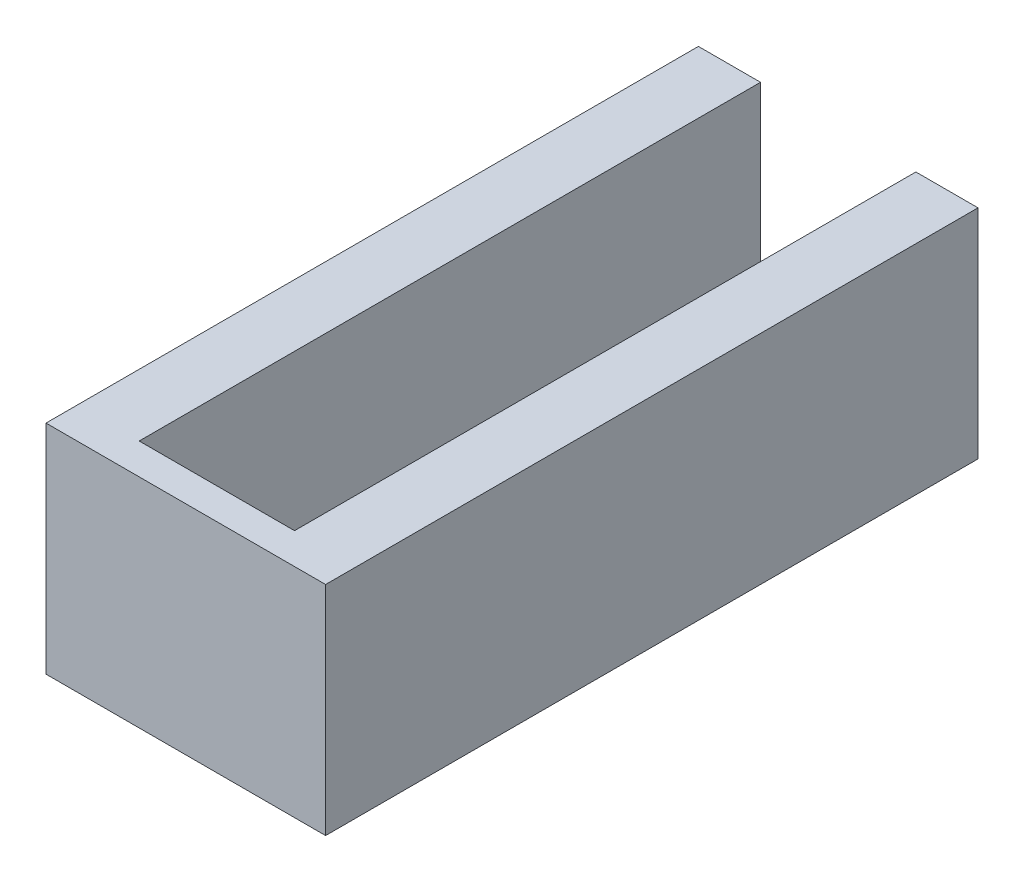
ISO-10303-21;
HEADER;
FILE_DESCRIPTION(('STEP AP214'),'2;1');
FILE_NAME('part.step','',(''),(''),'','','');
FILE_SCHEMA(('AUTOMOTIVE_DESIGN { 1 0 10303 214 1 1 1 1 }'));
ENDSEC;
DATA;
#1=APPLICATION_CONTEXT('core data for automotive mechanical design processes');
#2=APPLICATION_PROTOCOL_DEFINITION('international standard','automotive_design',2000,#1);
#3=PRODUCT_CONTEXT('',#1,'mechanical');
#4=PRODUCT('Part','Part','',(#3));
#5=PRODUCT_RELATED_PRODUCT_CATEGORY('part','',(#4));
#6=PRODUCT_DEFINITION_FORMATION('','',#4);
#7=PRODUCT_DEFINITION_CONTEXT('part definition',#1,'design');
#8=PRODUCT_DEFINITION('design','',#6,#7);
#9=PRODUCT_DEFINITION_SHAPE('','',#8);
#10=(LENGTH_UNIT() NAMED_UNIT(*) SI_UNIT(.MILLI.,.METRE.));
#11=(NAMED_UNIT(*) PLANE_ANGLE_UNIT() SI_UNIT($,.RADIAN.));
#12=(NAMED_UNIT(*) SI_UNIT($,.STERADIAN.) SOLID_ANGLE_UNIT());
#13=UNCERTAINTY_MEASURE_WITH_UNIT(LENGTH_MEASURE(1.E-05),#10,'distance_accuracy_value','');
#14=(GEOMETRIC_REPRESENTATION_CONTEXT(3) GLOBAL_UNCERTAINTY_ASSIGNED_CONTEXT((#13)) GLOBAL_UNIT_ASSIGNED_CONTEXT((#10,
#11,#12)) REPRESENTATION_CONTEXT('',''));
#15=CARTESIAN_POINT('',(0.,0.,0.));
#16=DIRECTION('',(0.,0.,1.));
#17=DIRECTION('',(1.,0.,0.));
#18=AXIS2_PLACEMENT_3D('',#15,#16,#17);
#19=CARTESIAN_POINT('',(-2.,0.,20.));
#20=DIRECTION('',(1.,0.,0.));
#21=DIRECTION('',(0.,0.,-1.));
#22=AXIS2_PLACEMENT_3D('',#19,#20,#21);
#23=PLANE('',#22);
#24=DIRECTION('',(0.,-1.,0.));
#25=VECTOR('',#24,1.);
#26=CARTESIAN_POINT('',(-2.,0.,0.));
#27=LINE('',#26,#25);
#28=CARTESIAN_POINT('',(-2.,0.,0.));
#29=VERTEX_POINT('',#28);
#30=CARTESIAN_POINT('',(-2.,-5.,0.));
#31=VERTEX_POINT('',#30);
#32=EDGE_CURVE('E184',#29,#31,#27,.T.);
#33=ORIENTED_EDGE('',*,*,#32,.T.);
#34=DIRECTION('',(0.,0.,-1.));
#35=VECTOR('',#34,1.);
#36=CARTESIAN_POINT('',(-2.,-5.,20.));
#37=LINE('',#36,#35);
#38=CARTESIAN_POINT('',(-2.,-5.,20.));
#39=VERTEX_POINT('',#38);
#40=EDGE_CURVE('E42',#39,#31,#37,.T.);
#41=ORIENTED_EDGE('',*,*,#40,.F.);
#42=DIRECTION('',(0.,-1.,0.));
#43=VECTOR('',#42,1.);
#44=CARTESIAN_POINT('',(-2.,0.,20.));
#45=LINE('',#44,#43);
#46=CARTESIAN_POINT('',(-2.,0.,20.));
#47=VERTEX_POINT('',#46);
#48=EDGE_CURVE('E91',#47,#39,#45,.T.);
#49=ORIENTED_EDGE('',*,*,#48,.F.);
#50=DIRECTION('',(0.,0.,-1.));
#51=VECTOR('',#50,1.);
#52=CARTESIAN_POINT('',(-2.,0.,20.));
#53=LINE('',#52,#51);
#54=EDGE_CURVE('E11',#47,#29,#53,.T.);
#55=ORIENTED_EDGE('',*,*,#54,.T.);
#56=EDGE_LOOP('',(#33,#41,#49,#55));
#57=FACE_BOUND('',#56,.T.);
#58=ADVANCED_FACE('F33',(#57),#23,.F.);
#59=CARTESIAN_POINT('',(-2.,-5.,20.));
#60=DIRECTION('',(0.,-1.,0.));
#61=DIRECTION('',(0.,0.,-1.));
#62=AXIS2_PLACEMENT_3D('',#59,#60,#61);
#63=PLANE('',#62);
#64=DIRECTION('',(-1.,0.,0.));
#65=VECTOR('',#64,1.);
#66=CARTESIAN_POINT('',(-2.,-5.,0.));
#67=LINE('',#66,#65);
#68=CARTESIAN_POINT('',(-7.,-5.,0.));
#69=VERTEX_POINT('',#68);
#70=EDGE_CURVE('E181',#31,#69,#67,.T.);
#71=ORIENTED_EDGE('',*,*,#70,.T.);
#72=DIRECTION('',(0.,0.,-1.));
#73=VECTOR('',#72,1.);
#74=CARTESIAN_POINT('',(-7.,-5.,20.));
#75=LINE('',#74,#73);
#76=CARTESIAN_POINT('',(-7.,-5.,20.));
#77=VERTEX_POINT('',#76);
#78=EDGE_CURVE('E50',#77,#69,#75,.T.);
#79=ORIENTED_EDGE('',*,*,#78,.F.);
#80=DIRECTION('',(-1.,0.,0.));
#81=VECTOR('',#80,1.);
#82=CARTESIAN_POINT('',(-2.,-5.,20.));
#83=LINE('',#82,#81);
#84=EDGE_CURVE('E140',#39,#77,#83,.T.);
#85=ORIENTED_EDGE('',*,*,#84,.F.);
#86=ORIENTED_EDGE('',*,*,#40,.T.);
#87=EDGE_LOOP('',(#71,#79,#85,#86));
#88=FACE_BOUND('',#87,.T.);
#89=ADVANCED_FACE('F187',(#88),#63,.F.);
#90=CARTESIAN_POINT('',(-7.,-5.,20.));
#91=DIRECTION('',(-1.,0.,0.));
#92=DIRECTION('',(0.,0.,1.));
#93=AXIS2_PLACEMENT_3D('',#90,#91,#92);
#94=PLANE('',#93);
#95=DIRECTION('',(0.,1.,0.));
#96=VECTOR('',#95,1.);
#97=CARTESIAN_POINT('',(-7.,-5.,0.));
#98=LINE('',#97,#96);
#99=CARTESIAN_POINT('',(-7.,0.,0.));
#100=VERTEX_POINT('',#99);
#101=EDGE_CURVE('E179',#69,#100,#98,.T.);
#102=ORIENTED_EDGE('',*,*,#101,.T.);
#103=DIRECTION('',(0.,0.,-1.));
#104=VECTOR('',#103,1.);
#105=CARTESIAN_POINT('',(-7.,0.,20.));
#106=LINE('',#105,#104);
#107=CARTESIAN_POINT('',(-7.,0.,20.));
#108=VERTEX_POINT('',#107);
#109=EDGE_CURVE('E165',#108,#100,#106,.T.);
#110=ORIENTED_EDGE('',*,*,#109,.F.);
#111=DIRECTION('',(0.,1.,0.));
#112=VECTOR('',#111,1.);
#113=CARTESIAN_POINT('',(-7.,-5.,20.));
#114=LINE('',#113,#112);
#115=EDGE_CURVE('E143',#77,#108,#114,.T.);
#116=ORIENTED_EDGE('',*,*,#115,.F.);
#117=ORIENTED_EDGE('',*,*,#78,.T.);
#118=EDGE_LOOP('',(#102,#110,#116,#117));
#119=FACE_BOUND('',#118,.T.);
#120=ADVANCED_FACE('F191',(#119),#94,.F.);
#121=CARTESIAN_POINT('',(-9.,0.,20.));
#122=DIRECTION('',(0.,-1.,0.));
#123=DIRECTION('',(0.,0.,-1.));
#124=AXIS2_PLACEMENT_3D('',#121,#122,#123);
#125=PLANE('',#124);
#126=DIRECTION('',(-1.,0.,0.));
#127=VECTOR('',#126,1.);
#128=CARTESIAN_POINT('',(-9.,0.,0.));
#129=LINE('',#128,#127);
#130=CARTESIAN_POINT('',(-9.,0.,0.));
#131=VERTEX_POINT('',#130);
#132=EDGE_CURVE('E172',#100,#131,#129,.T.);
#133=ORIENTED_EDGE('',*,*,#132,.T.);
#134=DIRECTION('',(0.,0.,-1.));
#135=VECTOR('',#134,1.);
#136=CARTESIAN_POINT('',(-9.,0.,20.));
#137=LINE('',#136,#135);
#138=CARTESIAN_POINT('',(-9.,0.,21.));
#139=VERTEX_POINT('',#138);
#140=EDGE_CURVE('E115',#139,#131,#137,.T.);
#141=ORIENTED_EDGE('',*,*,#140,.F.);
#142=DIRECTION('',(-1.,0.,0.));
#143=VECTOR('',#142,1.);
#144=CARTESIAN_POINT('',(-9.,0.,21.));
#145=LINE('',#144,#143);
#146=CARTESIAN_POINT('',(0.,0.,21.));
#147=VERTEX_POINT('',#146);
#148=EDGE_CURVE('E129',#147,#139,#145,.T.);
#149=ORIENTED_EDGE('',*,*,#148,.F.);
#150=DIRECTION('',(0.,0.,-1.));
#151=VECTOR('',#150,1.);
#152=CARTESIAN_POINT('',(0.,0.,20.));
#153=LINE('',#152,#151);
#154=CARTESIAN_POINT('',(0.,0.,0.));
#155=VERTEX_POINT('',#154);
#156=EDGE_CURVE('E151',#147,#155,#153,.T.);
#157=ORIENTED_EDGE('',*,*,#156,.T.);
#158=DIRECTION('',(-1.,0.,0.));
#159=VECTOR('',#158,1.);
#160=CARTESIAN_POINT('',(0.,0.,0.));
#161=LINE('',#160,#159);
#162=EDGE_CURVE('E137',#155,#29,#161,.T.);
#163=ORIENTED_EDGE('',*,*,#162,.T.);
#164=ORIENTED_EDGE('',*,*,#54,.F.);
#165=DIRECTION('',(-1.,0.,0.));
#166=VECTOR('',#165,1.);
#167=CARTESIAN_POINT('',(-9.,0.,20.));
#168=LINE('',#167,#166);
#169=EDGE_CURVE('E130',#47,#108,#168,.T.);
#170=ORIENTED_EDGE('',*,*,#169,.T.);
#171=ORIENTED_EDGE('',*,*,#109,.T.);
#172=EDGE_LOOP('',(#133,#141,#149,#157,#163,#164,#170,#171));
#173=FACE_BOUND('',#172,.T.);
#174=ADVANCED_FACE('F171',(#173),#125,.F.);
#175=CARTESIAN_POINT('',(-9.,-7.,20.));
#176=DIRECTION('',(1.,0.,0.));
#177=DIRECTION('',(0.,0.,-1.));
#178=AXIS2_PLACEMENT_3D('',#175,#176,#177);
#179=PLANE('',#178);
#180=DIRECTION('',(0.,-1.,0.));
#181=VECTOR('',#180,1.);
#182=CARTESIAN_POINT('',(-9.,-7.,0.));
#183=LINE('',#182,#181);
#184=CARTESIAN_POINT('',(-9.,-7.,0.));
#185=VERTEX_POINT('',#184);
#186=EDGE_CURVE('E114',#131,#185,#183,.T.);
#187=ORIENTED_EDGE('',*,*,#186,.T.);
#188=DIRECTION('',(0.,0.,-1.));
#189=VECTOR('',#188,1.);
#190=CARTESIAN_POINT('',(-9.,-7.,20.));
#191=LINE('',#190,#189);
#192=CARTESIAN_POINT('',(-9.,-7.,21.));
#193=VERTEX_POINT('',#192);
#194=EDGE_CURVE('E107',#193,#185,#191,.T.);
#195=ORIENTED_EDGE('',*,*,#194,.F.);
#196=DIRECTION('',(0.,-1.,0.));
#197=VECTOR('',#196,1.);
#198=CARTESIAN_POINT('',(-9.,-7.,21.));
#199=LINE('',#198,#197);
#200=EDGE_CURVE('E112',#139,#193,#199,.T.);
#201=ORIENTED_EDGE('',*,*,#200,.F.);
#202=ORIENTED_EDGE('',*,*,#140,.T.);
#203=EDGE_LOOP('',(#187,#195,#201,#202));
#204=FACE_BOUND('',#203,.T.);
#205=ADVANCED_FACE('F109',(#204),#179,.F.);
#206=CARTESIAN_POINT('',(0.,-7.,20.));
#207=DIRECTION('',(0.,1.,0.));
#208=DIRECTION('',(-1.,0.,0.));
#209=AXIS2_PLACEMENT_3D('',#206,#207,#208);
#210=PLANE('',#209);
#211=DIRECTION('',(1.,0.,0.));
#212=VECTOR('',#211,1.);
#213=CARTESIAN_POINT('',(0.,-7.,0.));
#214=LINE('',#213,#212);
#215=CARTESIAN_POINT('',(0.,-7.,0.));
#216=VERTEX_POINT('',#215);
#217=EDGE_CURVE('E80',#185,#216,#214,.T.);
#218=ORIENTED_EDGE('',*,*,#217,.T.);
#219=DIRECTION('',(0.,0.,-1.));
#220=VECTOR('',#219,1.);
#221=CARTESIAN_POINT('',(0.,-7.,20.));
#222=LINE('',#221,#220);
#223=CARTESIAN_POINT('',(0.,-7.,21.));
#224=VERTEX_POINT('',#223);
#225=EDGE_CURVE('E116',#224,#216,#222,.T.);
#226=ORIENTED_EDGE('',*,*,#225,.F.);
#227=DIRECTION('',(1.,0.,0.));
#228=VECTOR('',#227,1.);
#229=CARTESIAN_POINT('',(-9.,-7.,21.));
#230=LINE('',#229,#228);
#231=EDGE_CURVE('E119',#193,#224,#230,.T.);
#232=ORIENTED_EDGE('',*,*,#231,.F.);
#233=ORIENTED_EDGE('',*,*,#194,.T.);
#234=EDGE_LOOP('',(#218,#226,#232,#233));
#235=FACE_BOUND('',#234,.T.);
#236=ADVANCED_FACE('F120',(#235),#210,.F.);
#237=CARTESIAN_POINT('',(0.,0.,20.));
#238=DIRECTION('',(-1.,0.,0.));
#239=DIRECTION('',(0.,-1.,0.));
#240=AXIS2_PLACEMENT_3D('',#237,#238,#239);
#241=PLANE('',#240);
#242=DIRECTION('',(0.,1.,0.));
#243=VECTOR('',#242,1.);
#244=CARTESIAN_POINT('',(0.,0.,0.));
#245=LINE('',#244,#243);
#246=EDGE_CURVE('E86',#216,#155,#245,.T.);
#247=ORIENTED_EDGE('',*,*,#246,.T.);
#248=ORIENTED_EDGE('',*,*,#156,.F.);
#249=DIRECTION('',(0.,1.,0.));
#250=VECTOR('',#249,1.);
#251=CARTESIAN_POINT('',(0.,-7.,21.));
#252=LINE('',#251,#250);
#253=EDGE_CURVE('E124',#224,#147,#252,.T.);
#254=ORIENTED_EDGE('',*,*,#253,.F.);
#255=ORIENTED_EDGE('',*,*,#225,.T.);
#256=EDGE_LOOP('',(#247,#248,#254,#255));
#257=FACE_BOUND('',#256,.T.);
#258=ADVANCED_FACE('F203',(#257),#241,.F.);
#259=CARTESIAN_POINT('',(0.,0.,0.));
#260=DIRECTION('',(0.,0.,1.));
#261=DIRECTION('',(1.,0.,0.));
#262=AXIS2_PLACEMENT_3D('',#259,#260,#261);
#263=PLANE('',#262);
#264=ORIENTED_EDGE('',*,*,#162,.F.);
#265=ORIENTED_EDGE('',*,*,#246,.F.);
#266=ORIENTED_EDGE('',*,*,#217,.F.);
#267=ORIENTED_EDGE('',*,*,#186,.F.);
#268=ORIENTED_EDGE('',*,*,#132,.F.);
#269=ORIENTED_EDGE('',*,*,#101,.F.);
#270=ORIENTED_EDGE('',*,*,#70,.F.);
#271=ORIENTED_EDGE('',*,*,#32,.F.);
#272=EDGE_LOOP('',(#264,#265,#266,#267,#268,#269,#270,#271));
#273=FACE_BOUND('',#272,.T.);
#274=ADVANCED_FACE('F177',(#273),#263,.F.);
#275=CARTESIAN_POINT('',(0.,0.,21.));
#276=DIRECTION('',(0.,0.,-1.));
#277=DIRECTION('',(-1.,0.,0.));
#278=AXIS2_PLACEMENT_3D('',#275,#276,#277);
#279=PLANE('',#278);
#280=ORIENTED_EDGE('',*,*,#200,.T.);
#281=ORIENTED_EDGE('',*,*,#231,.T.);
#282=ORIENTED_EDGE('',*,*,#253,.T.);
#283=ORIENTED_EDGE('',*,*,#148,.T.);
#284=EDGE_LOOP('',(#280,#281,#282,#283));
#285=FACE_BOUND('',#284,.T.);
#286=ADVANCED_FACE('F127',(#285),#279,.F.);
#287=CARTESIAN_POINT('',(0.,0.,20.));
#288=DIRECTION('',(0.,0.,-1.));
#289=DIRECTION('',(-1.,0.,0.));
#290=AXIS2_PLACEMENT_3D('',#287,#288,#289);
#291=PLANE('',#290);
#292=ORIENTED_EDGE('',*,*,#169,.F.);
#293=ORIENTED_EDGE('',*,*,#48,.T.);
#294=ORIENTED_EDGE('',*,*,#84,.T.);
#295=ORIENTED_EDGE('',*,*,#115,.T.);
#296=EDGE_LOOP('',(#292,#293,#294,#295));
#297=FACE_BOUND('',#296,.T.);
#298=ADVANCED_FACE('F208',(#297),#291,.T.);
#299=CLOSED_SHELL('',(#58,#89,#120,#174,#205,#236,#258,#274,#286,#298));
#300=MANIFOLD_SOLID_BREP('B2',#299);
#301=ADVANCED_BREP_SHAPE_REPRESENTATION('',(#18,#300),#14);
#302=SHAPE_DEFINITION_REPRESENTATION(#9,#301);
ENDSEC;
END-ISO-10303-21;
